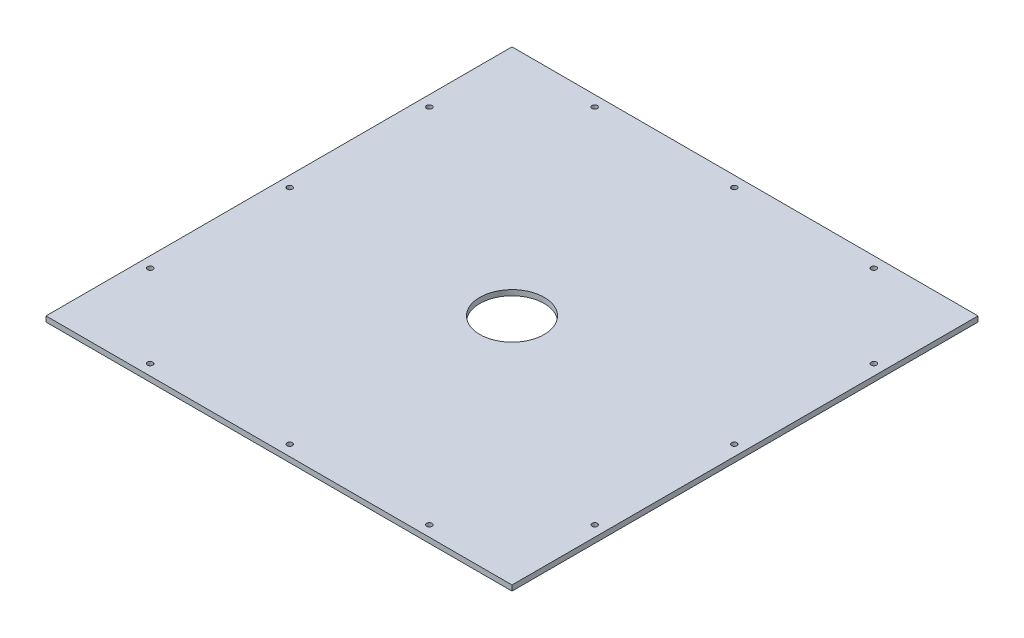
ISO-10303-21;
HEADER;
FILE_DESCRIPTION(('STEP AP214'),'2;1');
FILE_NAME('part.step','',(''),(''),'','','');
FILE_SCHEMA(('AUTOMOTIVE_DESIGN { 1 0 10303 214 1 1 1 1 }'));
ENDSEC;
DATA;
#1=APPLICATION_CONTEXT('core data for automotive mechanical design processes');
#2=APPLICATION_PROTOCOL_DEFINITION('international standard','automotive_design',2000,#1);
#3=PRODUCT_CONTEXT('',#1,'mechanical');
#4=PRODUCT('Part','Part','',(#3));
#5=PRODUCT_RELATED_PRODUCT_CATEGORY('part','',(#4));
#6=PRODUCT_DEFINITION_FORMATION('','',#4);
#7=PRODUCT_DEFINITION_CONTEXT('part definition',#1,'design');
#8=PRODUCT_DEFINITION('design','',#6,#7);
#9=PRODUCT_DEFINITION_SHAPE('','',#8);
#10=(LENGTH_UNIT() NAMED_UNIT(*) SI_UNIT(.MILLI.,.METRE.));
#11=(NAMED_UNIT(*) PLANE_ANGLE_UNIT() SI_UNIT($,.RADIAN.));
#12=(NAMED_UNIT(*) SI_UNIT($,.STERADIAN.) SOLID_ANGLE_UNIT());
#13=UNCERTAINTY_MEASURE_WITH_UNIT(LENGTH_MEASURE(1.E-05),#10,'distance_accuracy_value','');
#14=(GEOMETRIC_REPRESENTATION_CONTEXT(3) GLOBAL_UNCERTAINTY_ASSIGNED_CONTEXT((#13)) GLOBAL_UNIT_ASSIGNED_CONTEXT((#10,
#11,#12)) REPRESENTATION_CONTEXT('',''));
#15=CARTESIAN_POINT('',(0.,0.,0.));
#16=DIRECTION('',(0.,0.,1.));
#17=DIRECTION('',(1.,0.,0.));
#18=AXIS2_PLACEMENT_3D('',#15,#16,#17);
#19=CARTESIAN_POINT('',(0.,5.,0.));
#20=DIRECTION('',(0.,1.,0.));
#21=DIRECTION('',(0.,0.,1.));
#22=AXIS2_PLACEMENT_3D('',#19,#20,#21);
#23=PLANE('',#22);
#24=CARTESIAN_POINT('',(0.,5.,0.));
#25=DIRECTION('',(0.,1.,0.));
#26=DIRECTION('',(0.,0.,1.));
#27=AXIS2_PLACEMENT_3D('',#24,#25,#26);
#28=CIRCLE('',#27,30.);
#29=CARTESIAN_POINT('',(0.,5.,30.));
#30=VERTEX_POINT('',#29);
#31=EDGE_CURVE('E229',#30,#30,#28,.T.);
#32=ORIENTED_EDGE('',*,*,#31,.F.);
#33=EDGE_LOOP('',(#32));
#34=FACE_BOUND('',#33,.T.);
#35=CARTESIAN_POINT('',(-6.39469910293642E-13,5.,207.));
#36=DIRECTION('',(0.,-1.,0.));
#37=DIRECTION('',(0.,0.,-1.));
#38=AXIS2_PLACEMENT_3D('',#35,#36,#37);
#39=CIRCLE('',#38,2.5);
#40=CARTESIAN_POINT('',(-6.39469910293642E-13,5.,204.5));
#41=VERTEX_POINT('',#40);
#42=EDGE_CURVE('E194',#41,#41,#39,.T.);
#43=ORIENTED_EDGE('',*,*,#42,.T.);
#44=EDGE_LOOP('',(#43));
#45=FACE_BOUND('',#44,.T.);
#46=CARTESIAN_POINT('',(129.999999999999,5.,207.000000000001));
#47=DIRECTION('',(0.,-1.,0.));
#48=DIRECTION('',(0.,0.,-1.));
#49=AXIS2_PLACEMENT_3D('',#46,#47,#48);
#50=CIRCLE('',#49,2.5);
#51=CARTESIAN_POINT('',(129.999999999999,5.,204.500000000001));
#52=VERTEX_POINT('',#51);
#53=EDGE_CURVE('E186',#52,#52,#50,.T.);
#54=ORIENTED_EDGE('',*,*,#53,.T.);
#55=EDGE_LOOP('',(#54));
#56=FACE_BOUND('',#55,.T.);
#57=CARTESIAN_POINT('',(207.,5.,0.));
#58=DIRECTION('',(0.,-1.,0.));
#59=DIRECTION('',(0.,0.,-1.));
#60=AXIS2_PLACEMENT_3D('',#57,#58,#59);
#61=CIRCLE('',#60,2.5);
#62=CARTESIAN_POINT('',(207.,5.,-2.50000000000008));
#63=VERTEX_POINT('',#62);
#64=EDGE_CURVE('E170',#63,#63,#61,.T.);
#65=ORIENTED_EDGE('',*,*,#64,.T.);
#66=EDGE_LOOP('',(#65));
#67=FACE_BOUND('',#66,.T.);
#68=CARTESIAN_POINT('',(207.,5.,-130.));
#69=DIRECTION('',(0.,-1.,0.));
#70=DIRECTION('',(0.,0.,-1.));
#71=AXIS2_PLACEMENT_3D('',#68,#69,#70);
#72=CIRCLE('',#71,2.5);
#73=CARTESIAN_POINT('',(207.,5.,-132.5));
#74=VERTEX_POINT('',#73);
#75=EDGE_CURVE('E162',#74,#74,#72,.T.);
#76=ORIENTED_EDGE('',*,*,#75,.T.);
#77=EDGE_LOOP('',(#76));
#78=FACE_BOUND('',#77,.T.);
#79=CARTESIAN_POINT('',(-129.999999999999,5.,-207.000000000001));
#80=DIRECTION('',(0.,-1.,0.));
#81=DIRECTION('',(0.,0.,-1.));
#82=AXIS2_PLACEMENT_3D('',#79,#80,#81);
#83=CIRCLE('',#82,2.5);
#84=CARTESIAN_POINT('',(-129.999999999999,5.,-209.500000000001));
#85=VERTEX_POINT('',#84);
#86=EDGE_CURVE('E146',#85,#85,#83,.T.);
#87=ORIENTED_EDGE('',*,*,#86,.T.);
#88=EDGE_LOOP('',(#87));
#89=FACE_BOUND('',#88,.T.);
#90=CARTESIAN_POINT('',(-207.,5.,130.));
#91=DIRECTION('',(0.,-1.,0.));
#92=DIRECTION('',(0.,0.,-1.));
#93=AXIS2_PLACEMENT_3D('',#90,#91,#92);
#94=CIRCLE('',#93,2.5);
#95=CARTESIAN_POINT('',(-207.,5.,127.5));
#96=VERTEX_POINT('',#95);
#97=EDGE_CURVE('E133',#96,#96,#94,.T.);
#98=ORIENTED_EDGE('',*,*,#97,.T.);
#99=EDGE_LOOP('',(#98));
#100=FACE_BOUND('',#99,.T.);
#101=DIRECTION('',(0.,0.,-1.));
#102=VECTOR('',#101,1.);
#103=CARTESIAN_POINT('',(217.,5.,-217.));
#104=LINE('',#103,#102);
#105=CARTESIAN_POINT('',(217.,5.,217.));
#106=VERTEX_POINT('',#105);
#107=CARTESIAN_POINT('',(217.,5.,-217.));
#108=VERTEX_POINT('',#107);
#109=EDGE_CURVE('E95',#106,#108,#104,.T.);
#110=ORIENTED_EDGE('',*,*,#109,.T.);
#111=DIRECTION('',(-1.,0.,0.));
#112=VECTOR('',#111,1.);
#113=CARTESIAN_POINT('',(-217.,5.,-217.));
#114=LINE('',#113,#112);
#115=CARTESIAN_POINT('',(-217.,5.,-217.));
#116=VERTEX_POINT('',#115);
#117=EDGE_CURVE('E90',#108,#116,#114,.T.);
#118=ORIENTED_EDGE('',*,*,#117,.T.);
#119=DIRECTION('',(0.,0.,1.));
#120=VECTOR('',#119,1.);
#121=CARTESIAN_POINT('',(-217.,5.,-217.));
#122=LINE('',#121,#120);
#123=CARTESIAN_POINT('',(-217.,5.,217.));
#124=VERTEX_POINT('',#123);
#125=EDGE_CURVE('E93',#116,#124,#122,.T.);
#126=ORIENTED_EDGE('',*,*,#125,.T.);
#127=DIRECTION('',(1.,0.,0.));
#128=VECTOR('',#127,1.);
#129=CARTESIAN_POINT('',(-217.,5.,217.));
#130=LINE('',#129,#128);
#131=EDGE_CURVE('E60',#124,#106,#130,.T.);
#132=ORIENTED_EDGE('',*,*,#131,.T.);
#133=EDGE_LOOP('',(#110,#118,#126,#132));
#134=FACE_BOUND('',#133,.T.);
#135=CARTESIAN_POINT('',(-207.,5.,0.));
#136=DIRECTION('',(0.,1.,0.));
#137=DIRECTION('',(0.,0.,1.));
#138=AXIS2_PLACEMENT_3D('',#135,#136,#137);
#139=CIRCLE('',#138,2.5);
#140=CARTESIAN_POINT('',(-207.,5.,2.49999999999991));
#141=VERTEX_POINT('',#140);
#142=EDGE_CURVE('E209',#141,#141,#139,.T.);
#143=ORIENTED_EDGE('',*,*,#142,.F.);
#144=EDGE_LOOP('',(#143));
#145=FACE_BOUND('',#144,.T.);
#146=CARTESIAN_POINT('',(-207.,5.,-130.));
#147=DIRECTION('',(0.,1.,0.));
#148=DIRECTION('',(0.,0.,1.));
#149=AXIS2_PLACEMENT_3D('',#146,#147,#148);
#150=CIRCLE('',#149,2.5);
#151=CARTESIAN_POINT('',(-207.,5.,-127.5));
#152=VERTEX_POINT('',#151);
#153=EDGE_CURVE('E218',#152,#152,#150,.T.);
#154=ORIENTED_EDGE('',*,*,#153,.F.);
#155=EDGE_LOOP('',(#154));
#156=FACE_BOUND('',#155,.T.);
#157=CARTESIAN_POINT('',(8.06003363987416E-13,5.,-207.));
#158=DIRECTION('',(0.,1.,0.));
#159=DIRECTION('',(0.,0.,1.));
#160=AXIS2_PLACEMENT_3D('',#157,#158,#159);
#161=CIRCLE('',#160,2.49999999999999);
#162=CARTESIAN_POINT('',(8.06003363987416E-13,5.,-204.5));
#163=VERTEX_POINT('',#162);
#164=EDGE_CURVE('E145',#163,#163,#161,.T.);
#165=ORIENTED_EDGE('',*,*,#164,.F.);
#166=EDGE_LOOP('',(#165));
#167=FACE_BOUND('',#166,.T.);
#168=CARTESIAN_POINT('',(130.000000000001,5.,-207.));
#169=DIRECTION('',(0.,1.,0.));
#170=DIRECTION('',(0.,0.,1.));
#171=AXIS2_PLACEMENT_3D('',#168,#169,#170);
#172=CIRCLE('',#171,2.5);
#173=CARTESIAN_POINT('',(130.000000000001,5.,-204.5));
#174=VERTEX_POINT('',#173);
#175=EDGE_CURVE('E154',#174,#174,#172,.T.);
#176=ORIENTED_EDGE('',*,*,#175,.F.);
#177=EDGE_LOOP('',(#176));
#178=FACE_BOUND('',#177,.T.);
#179=CARTESIAN_POINT('',(207.,5.,130.));
#180=DIRECTION('',(0.,1.,0.));
#181=DIRECTION('',(0.,0.,1.));
#182=AXIS2_PLACEMENT_3D('',#179,#180,#181);
#183=CIRCLE('',#182,2.5);
#184=CARTESIAN_POINT('',(207.,5.,132.5));
#185=VERTEX_POINT('',#184);
#186=EDGE_CURVE('E178',#185,#185,#183,.T.);
#187=ORIENTED_EDGE('',*,*,#186,.F.);
#188=EDGE_LOOP('',(#187));
#189=FACE_BOUND('',#188,.T.);
#190=CARTESIAN_POINT('',(-130.000000000001,5.,207.));
#191=DIRECTION('',(0.,1.,0.));
#192=DIRECTION('',(0.,0.,1.));
#193=AXIS2_PLACEMENT_3D('',#190,#191,#192);
#194=CIRCLE('',#193,2.5);
#195=CARTESIAN_POINT('',(-130.000000000001,5.,209.5));
#196=VERTEX_POINT('',#195);
#197=EDGE_CURVE('E137',#196,#196,#194,.T.);
#198=ORIENTED_EDGE('',*,*,#197,.F.);
#199=EDGE_LOOP('',(#198));
#200=FACE_BOUND('',#199,.T.);
#201=ADVANCED_FACE('F42',(#34,#45,#56,#67,#78,#89,#100,#134,#145,#156,#167,#178,#189,#200),#23,.T.);
#202=CARTESIAN_POINT('',(0.,0.,0.));
#203=DIRECTION('',(0.,1.,0.));
#204=DIRECTION('',(0.,0.,1.));
#205=AXIS2_PLACEMENT_3D('',#202,#203,#204);
#206=PLANE('',#205);
#207=CARTESIAN_POINT('',(0.,0.,0.));
#208=DIRECTION('',(0.,1.,0.));
#209=DIRECTION('',(0.,0.,1.));
#210=AXIS2_PLACEMENT_3D('',#207,#208,#209);
#211=CIRCLE('',#210,30.);
#212=CARTESIAN_POINT('',(0.,0.,30.));
#213=VERTEX_POINT('',#212);
#214=EDGE_CURVE('E210',#213,#213,#211,.T.);
#215=ORIENTED_EDGE('',*,*,#214,.T.);
#216=EDGE_LOOP('',(#215));
#217=FACE_BOUND('',#216,.T.);
#218=CARTESIAN_POINT('',(207.,0.,130.));
#219=DIRECTION('',(0.,1.,0.));
#220=DIRECTION('',(0.,0.,1.));
#221=AXIS2_PLACEMENT_3D('',#218,#219,#220);
#222=CIRCLE('',#221,2.5);
#223=CARTESIAN_POINT('',(207.,0.,132.5));
#224=VERTEX_POINT('',#223);
#225=EDGE_CURVE('E174',#224,#224,#222,.T.);
#226=ORIENTED_EDGE('',*,*,#225,.T.);
#227=EDGE_LOOP('',(#226));
#228=FACE_BOUND('',#227,.T.);
#229=CARTESIAN_POINT('',(207.,0.,0.));
#230=DIRECTION('',(0.,-1.,0.));
#231=DIRECTION('',(0.,0.,-1.));
#232=AXIS2_PLACEMENT_3D('',#229,#230,#231);
#233=CIRCLE('',#232,2.5);
#234=CARTESIAN_POINT('',(207.,0.,-2.50000000000008));
#235=VERTEX_POINT('',#234);
#236=EDGE_CURVE('E166',#235,#235,#233,.T.);
#237=ORIENTED_EDGE('',*,*,#236,.F.);
#238=EDGE_LOOP('',(#237));
#239=FACE_BOUND('',#238,.T.);
#240=CARTESIAN_POINT('',(207.,0.,-130.));
#241=DIRECTION('',(0.,-1.,0.));
#242=DIRECTION('',(0.,0.,-1.));
#243=AXIS2_PLACEMENT_3D('',#240,#241,#242);
#244=CIRCLE('',#243,2.5);
#245=CARTESIAN_POINT('',(207.,0.,-132.5));
#246=VERTEX_POINT('',#245);
#247=EDGE_CURVE('E158',#246,#246,#244,.T.);
#248=ORIENTED_EDGE('',*,*,#247,.F.);
#249=EDGE_LOOP('',(#248));
#250=FACE_BOUND('',#249,.T.);
#251=CARTESIAN_POINT('',(8.06003363987416E-13,0.,-207.));
#252=DIRECTION('',(0.,1.,0.));
#253=DIRECTION('',(0.,0.,1.));
#254=AXIS2_PLACEMENT_3D('',#251,#252,#253);
#255=CIRCLE('',#254,2.49999999999999);
#256=CARTESIAN_POINT('',(8.06003363987416E-13,0.,-204.5));
#257=VERTEX_POINT('',#256);
#258=EDGE_CURVE('E141',#257,#257,#255,.T.);
#259=ORIENTED_EDGE('',*,*,#258,.T.);
#260=EDGE_LOOP('',(#259));
#261=FACE_BOUND('',#260,.T.);
#262=CARTESIAN_POINT('',(-129.999999999999,0.,-207.000000000001));
#263=DIRECTION('',(0.,-1.,0.));
#264=DIRECTION('',(0.,0.,-1.));
#265=AXIS2_PLACEMENT_3D('',#262,#263,#264);
#266=CIRCLE('',#265,2.5);
#267=CARTESIAN_POINT('',(-129.999999999999,0.,-209.500000000001));
#268=VERTEX_POINT('',#267);
#269=EDGE_CURVE('E222',#268,#268,#266,.T.);
#270=ORIENTED_EDGE('',*,*,#269,.F.);
#271=EDGE_LOOP('',(#270));
#272=FACE_BOUND('',#271,.T.);
#273=CARTESIAN_POINT('',(-207.,0.,0.));
#274=DIRECTION('',(0.,1.,0.));
#275=DIRECTION('',(0.,0.,1.));
#276=AXIS2_PLACEMENT_3D('',#273,#274,#275);
#277=CIRCLE('',#276,2.5);
#278=CARTESIAN_POINT('',(-207.,0.,2.49999999999991));
#279=VERTEX_POINT('',#278);
#280=EDGE_CURVE('E205',#279,#279,#277,.T.);
#281=ORIENTED_EDGE('',*,*,#280,.T.);
#282=EDGE_LOOP('',(#281));
#283=FACE_BOUND('',#282,.T.);
#284=CARTESIAN_POINT('',(-207.,0.,130.));
#285=DIRECTION('',(0.,-1.,0.));
#286=DIRECTION('',(0.,0.,-1.));
#287=AXIS2_PLACEMENT_3D('',#284,#285,#286);
#288=CIRCLE('',#287,2.5);
#289=CARTESIAN_POINT('',(-207.,0.,127.5));
#290=VERTEX_POINT('',#289);
#291=EDGE_CURVE('E115',#290,#290,#288,.T.);
#292=ORIENTED_EDGE('',*,*,#291,.F.);
#293=EDGE_LOOP('',(#292));
#294=FACE_BOUND('',#293,.T.);
#295=DIRECTION('',(0.,0.,-1.));
#296=VECTOR('',#295,1.);
#297=CARTESIAN_POINT('',(217.,0.,-217.));
#298=LINE('',#297,#296);
#299=CARTESIAN_POINT('',(217.,0.,217.));
#300=VERTEX_POINT('',#299);
#301=CARTESIAN_POINT('',(217.,0.,-217.));
#302=VERTEX_POINT('',#301);
#303=EDGE_CURVE('E111',#300,#302,#298,.T.);
#304=ORIENTED_EDGE('',*,*,#303,.F.);
#305=DIRECTION('',(1.,0.,0.));
#306=VECTOR('',#305,1.);
#307=CARTESIAN_POINT('',(-217.,0.,217.));
#308=LINE('',#307,#306);
#309=CARTESIAN_POINT('',(-217.,0.,217.));
#310=VERTEX_POINT('',#309);
#311=EDGE_CURVE('E83',#310,#300,#308,.T.);
#312=ORIENTED_EDGE('',*,*,#311,.F.);
#313=DIRECTION('',(0.,0.,1.));
#314=VECTOR('',#313,1.);
#315=CARTESIAN_POINT('',(-217.,0.,-217.));
#316=LINE('',#315,#314);
#317=CARTESIAN_POINT('',(-217.,0.,-217.));
#318=VERTEX_POINT('',#317);
#319=EDGE_CURVE('E77',#318,#310,#316,.T.);
#320=ORIENTED_EDGE('',*,*,#319,.F.);
#321=DIRECTION('',(-1.,0.,0.));
#322=VECTOR('',#321,1.);
#323=CARTESIAN_POINT('',(-217.,0.,-217.));
#324=LINE('',#323,#322);
#325=EDGE_CURVE('E100',#302,#318,#324,.T.);
#326=ORIENTED_EDGE('',*,*,#325,.F.);
#327=EDGE_LOOP('',(#304,#312,#320,#326));
#328=FACE_BOUND('',#327,.T.);
#329=CARTESIAN_POINT('',(-207.,0.,-130.));
#330=DIRECTION('',(0.,1.,0.));
#331=DIRECTION('',(0.,0.,1.));
#332=AXIS2_PLACEMENT_3D('',#329,#330,#331);
#333=CIRCLE('',#332,2.5);
#334=CARTESIAN_POINT('',(-207.,0.,-127.5));
#335=VERTEX_POINT('',#334);
#336=EDGE_CURVE('E214',#335,#335,#333,.T.);
#337=ORIENTED_EDGE('',*,*,#336,.T.);
#338=EDGE_LOOP('',(#337));
#339=FACE_BOUND('',#338,.T.);
#340=CARTESIAN_POINT('',(130.000000000001,0.,-207.));
#341=DIRECTION('',(0.,1.,0.));
#342=DIRECTION('',(0.,0.,1.));
#343=AXIS2_PLACEMENT_3D('',#340,#341,#342);
#344=CIRCLE('',#343,2.5);
#345=CARTESIAN_POINT('',(130.000000000001,0.,-204.5));
#346=VERTEX_POINT('',#345);
#347=EDGE_CURVE('E150',#346,#346,#344,.T.);
#348=ORIENTED_EDGE('',*,*,#347,.T.);
#349=EDGE_LOOP('',(#348));
#350=FACE_BOUND('',#349,.T.);
#351=CARTESIAN_POINT('',(129.999999999999,0.,207.000000000001));
#352=DIRECTION('',(0.,-1.,0.));
#353=DIRECTION('',(0.,0.,-1.));
#354=AXIS2_PLACEMENT_3D('',#351,#352,#353);
#355=CIRCLE('',#354,2.5);
#356=CARTESIAN_POINT('',(129.999999999999,0.,204.500000000001));
#357=VERTEX_POINT('',#356);
#358=EDGE_CURVE('E182',#357,#357,#355,.T.);
#359=ORIENTED_EDGE('',*,*,#358,.F.);
#360=EDGE_LOOP('',(#359));
#361=FACE_BOUND('',#360,.T.);
#362=CARTESIAN_POINT('',(-6.39469910293642E-13,0.,207.));
#363=DIRECTION('',(0.,-1.,0.));
#364=DIRECTION('',(0.,0.,-1.));
#365=AXIS2_PLACEMENT_3D('',#362,#363,#364);
#366=CIRCLE('',#365,2.5);
#367=CARTESIAN_POINT('',(-6.39469910293642E-13,0.,204.5));
#368=VERTEX_POINT('',#367);
#369=EDGE_CURVE('E190',#368,#368,#366,.T.);
#370=ORIENTED_EDGE('',*,*,#369,.F.);
#371=EDGE_LOOP('',(#370));
#372=FACE_BOUND('',#371,.T.);
#373=CARTESIAN_POINT('',(-130.000000000001,0.,207.));
#374=DIRECTION('',(0.,1.,0.));
#375=DIRECTION('',(0.,0.,1.));
#376=AXIS2_PLACEMENT_3D('',#373,#374,#375);
#377=CIRCLE('',#376,2.5);
#378=CARTESIAN_POINT('',(-130.000000000001,0.,209.5));
#379=VERTEX_POINT('',#378);
#380=EDGE_CURVE('E198',#379,#379,#377,.T.);
#381=ORIENTED_EDGE('',*,*,#380,.T.);
#382=EDGE_LOOP('',(#381));
#383=FACE_BOUND('',#382,.T.);
#384=ADVANCED_FACE('F128',(#217,#228,#239,#250,#261,#272,#283,#294,#328,#339,#350,#361,#372,
#383),#206,.F.);
#385=CARTESIAN_POINT('',(217.,5.,-217.));
#386=DIRECTION('',(-1.,0.,0.));
#387=DIRECTION('',(0.,0.,1.));
#388=AXIS2_PLACEMENT_3D('',#385,#386,#387);
#389=PLANE('',#388);
#390=ORIENTED_EDGE('',*,*,#303,.T.);
#391=DIRECTION('',(0.,-1.,0.));
#392=VECTOR('',#391,1.);
#393=CARTESIAN_POINT('',(217.,5.,-217.));
#394=LINE('',#393,#392);
#395=EDGE_CURVE('E11',#108,#302,#394,.T.);
#396=ORIENTED_EDGE('',*,*,#395,.F.);
#397=ORIENTED_EDGE('',*,*,#109,.F.);
#398=DIRECTION('',(0.,-1.,0.));
#399=VECTOR('',#398,1.);
#400=CARTESIAN_POINT('',(217.,5.,217.));
#401=LINE('',#400,#399);
#402=EDGE_CURVE('E107',#106,#300,#401,.T.);
#403=ORIENTED_EDGE('',*,*,#402,.T.);
#404=EDGE_LOOP('',(#390,#396,#397,#403));
#405=FACE_BOUND('',#404,.T.);
#406=ADVANCED_FACE('F44',(#405),#389,.F.);
#407=CARTESIAN_POINT('',(-217.,5.,-217.));
#408=DIRECTION('',(0.,0.,1.));
#409=DIRECTION('',(1.,0.,0.));
#410=AXIS2_PLACEMENT_3D('',#407,#408,#409);
#411=PLANE('',#410);
#412=ORIENTED_EDGE('',*,*,#325,.T.);
#413=DIRECTION('',(0.,-1.,0.));
#414=VECTOR('',#413,1.);
#415=CARTESIAN_POINT('',(-217.,5.,-217.));
#416=LINE('',#415,#414);
#417=EDGE_CURVE('E52',#116,#318,#416,.T.);
#418=ORIENTED_EDGE('',*,*,#417,.F.);
#419=ORIENTED_EDGE('',*,*,#117,.F.);
#420=ORIENTED_EDGE('',*,*,#395,.T.);
#421=EDGE_LOOP('',(#412,#418,#419,#420));
#422=FACE_BOUND('',#421,.T.);
#423=ADVANCED_FACE('F99',(#422),#411,.F.);
#424=CARTESIAN_POINT('',(-217.,5.,-217.));
#425=DIRECTION('',(1.,0.,0.));
#426=DIRECTION('',(0.,0.,-1.));
#427=AXIS2_PLACEMENT_3D('',#424,#425,#426);
#428=PLANE('',#427);
#429=ORIENTED_EDGE('',*,*,#319,.T.);
#430=DIRECTION('',(0.,-1.,0.));
#431=VECTOR('',#430,1.);
#432=CARTESIAN_POINT('',(-217.,5.,217.));
#433=LINE('',#432,#431);
#434=EDGE_CURVE('E102',#124,#310,#433,.T.);
#435=ORIENTED_EDGE('',*,*,#434,.F.);
#436=ORIENTED_EDGE('',*,*,#125,.F.);
#437=ORIENTED_EDGE('',*,*,#417,.T.);
#438=EDGE_LOOP('',(#429,#435,#436,#437));
#439=FACE_BOUND('',#438,.T.);
#440=ADVANCED_FACE('F103',(#439),#428,.F.);
#441=CARTESIAN_POINT('',(-217.,5.,217.));
#442=DIRECTION('',(0.,0.,-1.));
#443=DIRECTION('',(-1.,0.,0.));
#444=AXIS2_PLACEMENT_3D('',#441,#442,#443);
#445=PLANE('',#444);
#446=ORIENTED_EDGE('',*,*,#311,.T.);
#447=ORIENTED_EDGE('',*,*,#402,.F.);
#448=ORIENTED_EDGE('',*,*,#131,.F.);
#449=ORIENTED_EDGE('',*,*,#434,.T.);
#450=EDGE_LOOP('',(#446,#447,#448,#449));
#451=FACE_BOUND('',#450,.T.);
#452=ADVANCED_FACE('F125',(#451),#445,.F.);
#453=CARTESIAN_POINT('',(-207.,0.,130.));
#454=DIRECTION('',(0.,1.,0.));
#455=DIRECTION('',(0.,0.,1.));
#456=AXIS2_PLACEMENT_3D('',#453,#454,#455);
#457=CYLINDRICAL_SURFACE('',#456,2.5);
#458=ORIENTED_EDGE('',*,*,#291,.T.);
#459=EDGE_LOOP('',(#458));
#460=FACE_BOUND('',#459,.T.);
#461=ORIENTED_EDGE('',*,*,#97,.F.);
#462=EDGE_LOOP('',(#461));
#463=FACE_BOUND('',#462,.T.);
#464=ADVANCED_FACE('F261',(#460,#463),#457,.F.);
#465=CARTESIAN_POINT('',(-207.,0.,0.));
#466=DIRECTION('',(0.,1.,0.));
#467=DIRECTION('',(0.,0.,1.));
#468=AXIS2_PLACEMENT_3D('',#465,#466,#467);
#469=CYLINDRICAL_SURFACE('',#468,2.5);
#470=ORIENTED_EDGE('',*,*,#280,.F.);
#471=EDGE_LOOP('',(#470));
#472=FACE_BOUND('',#471,.T.);
#473=ORIENTED_EDGE('',*,*,#142,.T.);
#474=EDGE_LOOP('',(#473));
#475=FACE_BOUND('',#474,.T.);
#476=ADVANCED_FACE('F263',(#472,#475),#469,.F.);
#477=CARTESIAN_POINT('',(-207.,0.,-130.));
#478=DIRECTION('',(0.,1.,0.));
#479=DIRECTION('',(0.,0.,1.));
#480=AXIS2_PLACEMENT_3D('',#477,#478,#479);
#481=CYLINDRICAL_SURFACE('',#480,2.5);
#482=ORIENTED_EDGE('',*,*,#336,.F.);
#483=EDGE_LOOP('',(#482));
#484=FACE_BOUND('',#483,.T.);
#485=ORIENTED_EDGE('',*,*,#153,.T.);
#486=EDGE_LOOP('',(#485));
#487=FACE_BOUND('',#486,.T.);
#488=ADVANCED_FACE('F270',(#484,#487),#481,.F.);
#489=CARTESIAN_POINT('',(-129.999999999999,0.,-207.000000000001));
#490=DIRECTION('',(0.,1.,0.));
#491=DIRECTION('',(0.,0.,1.));
#492=AXIS2_PLACEMENT_3D('',#489,#490,#491);
#493=CYLINDRICAL_SURFACE('',#492,2.5);
#494=ORIENTED_EDGE('',*,*,#269,.T.);
#495=EDGE_LOOP('',(#494));
#496=FACE_BOUND('',#495,.T.);
#497=ORIENTED_EDGE('',*,*,#86,.F.);
#498=EDGE_LOOP('',(#497));
#499=FACE_BOUND('',#498,.T.);
#500=ADVANCED_FACE('F332',(#496,#499),#493,.F.);
#501=CARTESIAN_POINT('',(8.06003363987416E-13,0.,-207.));
#502=DIRECTION('',(0.,1.,0.));
#503=DIRECTION('',(0.,0.,1.));
#504=AXIS2_PLACEMENT_3D('',#501,#502,#503);
#505=CYLINDRICAL_SURFACE('',#504,2.49999999999999);
#506=ORIENTED_EDGE('',*,*,#258,.F.);
#507=EDGE_LOOP('',(#506));
#508=FACE_BOUND('',#507,.T.);
#509=ORIENTED_EDGE('',*,*,#164,.T.);
#510=EDGE_LOOP('',(#509));
#511=FACE_BOUND('',#510,.T.);
#512=ADVANCED_FACE('F276',(#508,#511),#505,.F.);
#513=CARTESIAN_POINT('',(130.000000000001,0.,-207.));
#514=DIRECTION('',(0.,1.,0.));
#515=DIRECTION('',(0.,0.,1.));
#516=AXIS2_PLACEMENT_3D('',#513,#514,#515);
#517=CYLINDRICAL_SURFACE('',#516,2.5);
#518=ORIENTED_EDGE('',*,*,#347,.F.);
#519=EDGE_LOOP('',(#518));
#520=FACE_BOUND('',#519,.T.);
#521=ORIENTED_EDGE('',*,*,#175,.T.);
#522=EDGE_LOOP('',(#521));
#523=FACE_BOUND('',#522,.T.);
#524=ADVANCED_FACE('F353',(#520,#523),#517,.F.);
#525=CARTESIAN_POINT('',(207.,0.,-130.));
#526=DIRECTION('',(0.,1.,0.));
#527=DIRECTION('',(0.,0.,1.));
#528=AXIS2_PLACEMENT_3D('',#525,#526,#527);
#529=CYLINDRICAL_SURFACE('',#528,2.5);
#530=ORIENTED_EDGE('',*,*,#247,.T.);
#531=EDGE_LOOP('',(#530));
#532=FACE_BOUND('',#531,.T.);
#533=ORIENTED_EDGE('',*,*,#75,.F.);
#534=EDGE_LOOP('',(#533));
#535=FACE_BOUND('',#534,.T.);
#536=ADVANCED_FACE('F363',(#532,#535),#529,.F.);
#537=CARTESIAN_POINT('',(207.,0.,0.));
#538=DIRECTION('',(0.,1.,0.));
#539=DIRECTION('',(0.,0.,1.));
#540=AXIS2_PLACEMENT_3D('',#537,#538,#539);
#541=CYLINDRICAL_SURFACE('',#540,2.5);
#542=ORIENTED_EDGE('',*,*,#236,.T.);
#543=EDGE_LOOP('',(#542));
#544=FACE_BOUND('',#543,.T.);
#545=ORIENTED_EDGE('',*,*,#64,.F.);
#546=EDGE_LOOP('',(#545));
#547=FACE_BOUND('',#546,.T.);
#548=ADVANCED_FACE('F373',(#544,#547),#541,.F.);
#549=CARTESIAN_POINT('',(207.,0.,130.));
#550=DIRECTION('',(0.,1.,0.));
#551=DIRECTION('',(0.,0.,1.));
#552=AXIS2_PLACEMENT_3D('',#549,#550,#551);
#553=CYLINDRICAL_SURFACE('',#552,2.5);
#554=ORIENTED_EDGE('',*,*,#225,.F.);
#555=EDGE_LOOP('',(#554));
#556=FACE_BOUND('',#555,.T.);
#557=ORIENTED_EDGE('',*,*,#186,.T.);
#558=EDGE_LOOP('',(#557));
#559=FACE_BOUND('',#558,.T.);
#560=ADVANCED_FACE('F384',(#556,#559),#553,.F.);
#561=CARTESIAN_POINT('',(129.999999999999,0.,207.000000000001));
#562=DIRECTION('',(0.,1.,0.));
#563=DIRECTION('',(0.,0.,1.));
#564=AXIS2_PLACEMENT_3D('',#561,#562,#563);
#565=CYLINDRICAL_SURFACE('',#564,2.5);
#566=ORIENTED_EDGE('',*,*,#358,.T.);
#567=EDGE_LOOP('',(#566));
#568=FACE_BOUND('',#567,.T.);
#569=ORIENTED_EDGE('',*,*,#53,.F.);
#570=EDGE_LOOP('',(#569));
#571=FACE_BOUND('',#570,.T.);
#572=ADVANCED_FACE('F395',(#568,#571),#565,.F.);
#573=CARTESIAN_POINT('',(-6.39469910293642E-13,0.,207.));
#574=DIRECTION('',(0.,1.,0.));
#575=DIRECTION('',(0.,0.,1.));
#576=AXIS2_PLACEMENT_3D('',#573,#574,#575);
#577=CYLINDRICAL_SURFACE('',#576,2.5);
#578=ORIENTED_EDGE('',*,*,#369,.T.);
#579=EDGE_LOOP('',(#578));
#580=FACE_BOUND('',#579,.T.);
#581=ORIENTED_EDGE('',*,*,#42,.F.);
#582=EDGE_LOOP('',(#581));
#583=FACE_BOUND('',#582,.T.);
#584=ADVANCED_FACE('F406',(#580,#583),#577,.F.);
#585=CARTESIAN_POINT('',(-130.000000000001,0.,207.));
#586=DIRECTION('',(0.,1.,0.));
#587=DIRECTION('',(0.,0.,1.));
#588=AXIS2_PLACEMENT_3D('',#585,#586,#587);
#589=CYLINDRICAL_SURFACE('',#588,2.5);
#590=ORIENTED_EDGE('',*,*,#380,.F.);
#591=EDGE_LOOP('',(#590));
#592=FACE_BOUND('',#591,.T.);
#593=ORIENTED_EDGE('',*,*,#197,.T.);
#594=EDGE_LOOP('',(#593));
#595=FACE_BOUND('',#594,.T.);
#596=ADVANCED_FACE('F242',(#592,#595),#589,.F.);
#597=CARTESIAN_POINT('',(0.,0.,0.));
#598=DIRECTION('',(0.,1.,0.));
#599=DIRECTION('',(0.,0.,1.));
#600=AXIS2_PLACEMENT_3D('',#597,#598,#599);
#601=CYLINDRICAL_SURFACE('',#600,30.);
#602=ORIENTED_EDGE('',*,*,#214,.F.);
#603=EDGE_LOOP('',(#602));
#604=FACE_BOUND('',#603,.T.);
#605=ORIENTED_EDGE('',*,*,#31,.T.);
#606=EDGE_LOOP('',(#605));
#607=FACE_BOUND('',#606,.T.);
#608=ADVANCED_FACE('F239',(#604,#607),#601,.F.);
#609=CLOSED_SHELL('',(#201,#384,#406,#423,#440,#452,#464,#476,#488,#500,#512,#524,#536,#548,
#560,#572,#584,#596,#608));
#610=MANIFOLD_SOLID_BREP('B2',#609);
#611=ADVANCED_BREP_SHAPE_REPRESENTATION('',(#18,#610),#14);
#612=SHAPE_DEFINITION_REPRESENTATION(#9,#611);
ENDSEC;
END-ISO-10303-21;
